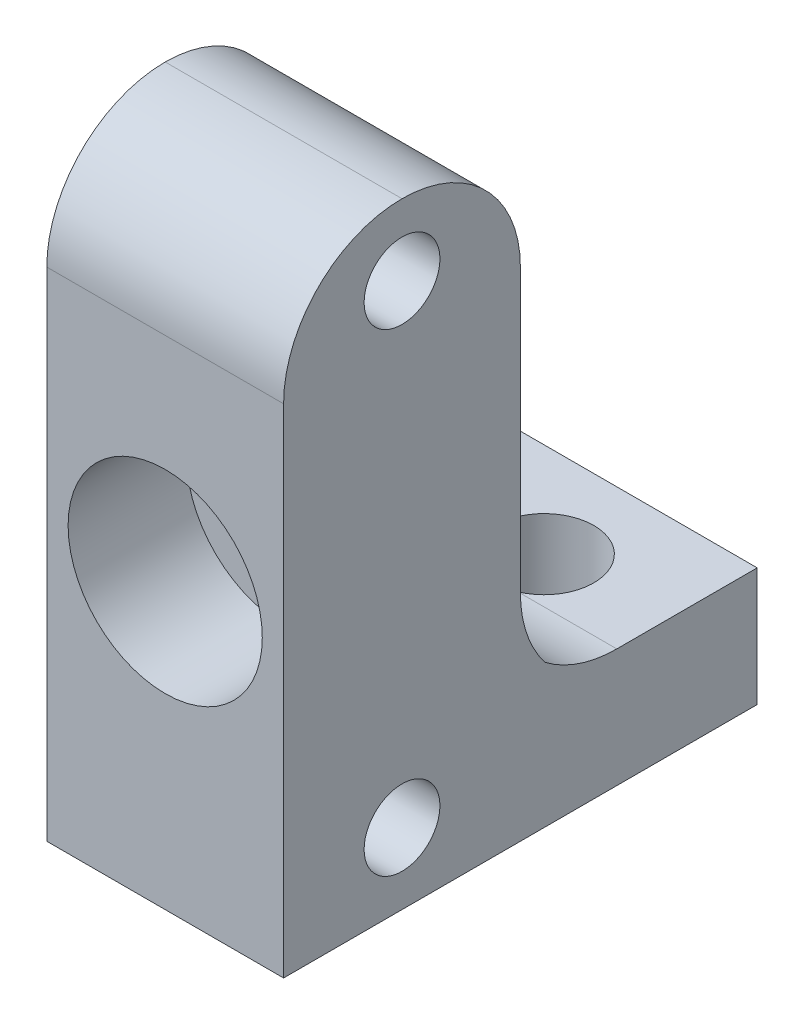
ISO-10303-21;
HEADER;
FILE_DESCRIPTION(('STEP AP214'),'2;1');
FILE_NAME('part.step','',(''),(''),'','','');
FILE_SCHEMA(('AUTOMOTIVE_DESIGN { 1 0 10303 214 1 1 1 1 }'));
ENDSEC;
DATA;
#1=APPLICATION_CONTEXT('core data for automotive mechanical design processes');
#2=APPLICATION_PROTOCOL_DEFINITION('international standard','automotive_design',2000,#1);
#3=PRODUCT_CONTEXT('',#1,'mechanical');
#4=PRODUCT('Part','Part','',(#3));
#5=PRODUCT_RELATED_PRODUCT_CATEGORY('part','',(#4));
#6=PRODUCT_DEFINITION_FORMATION('','',#4);
#7=PRODUCT_DEFINITION_CONTEXT('part definition',#1,'design');
#8=PRODUCT_DEFINITION('design','',#6,#7);
#9=PRODUCT_DEFINITION_SHAPE('','',#8);
#10=(LENGTH_UNIT() NAMED_UNIT(*) SI_UNIT(.MILLI.,.METRE.));
#11=(NAMED_UNIT(*) PLANE_ANGLE_UNIT() SI_UNIT($,.RADIAN.));
#12=(NAMED_UNIT(*) SI_UNIT($,.STERADIAN.) SOLID_ANGLE_UNIT());
#13=UNCERTAINTY_MEASURE_WITH_UNIT(LENGTH_MEASURE(1.E-05),#10,'distance_accuracy_value','');
#14=(GEOMETRIC_REPRESENTATION_CONTEXT(3) GLOBAL_UNCERTAINTY_ASSIGNED_CONTEXT((#13)) GLOBAL_UNIT_ASSIGNED_CONTEXT((#10,
#11,#12)) REPRESENTATION_CONTEXT('',''));
#15=CARTESIAN_POINT('',(0.,0.,0.));
#16=DIRECTION('',(0.,0.,1.));
#17=DIRECTION('',(1.,0.,0.));
#18=AXIS2_PLACEMENT_3D('',#15,#16,#17);
#19=CARTESIAN_POINT('',(5.,12.,10.));
#20=DIRECTION('',(0.,0.,-1.));
#21=DIRECTION('',(-1.,0.,0.));
#22=AXIS2_PLACEMENT_3D('',#19,#20,#21);
#23=CYLINDRICAL_SURFACE('',#22,4.1);
#24=CARTESIAN_POINT('',(5.,12.,10.));
#25=DIRECTION('',(0.,0.,1.));
#26=DIRECTION('',(1.,0.,0.));
#27=AXIS2_PLACEMENT_3D('',#24,#25,#26);
#28=CIRCLE('',#27,4.1);
#29=CARTESIAN_POINT('',(9.1,12.,10.));
#30=VERTEX_POINT('',#29);
#31=EDGE_CURVE('E191',#30,#30,#28,.T.);
#32=ORIENTED_EDGE('',*,*,#31,.T.);
#33=EDGE_LOOP('',(#32));
#34=FACE_BOUND('',#33,.T.);
#35=CARTESIAN_POINT('',(5.,12.,5.));
#36=DIRECTION('',(0.,0.,-1.));
#37=DIRECTION('',(-1.,0.,0.));
#38=AXIS2_PLACEMENT_3D('',#35,#36,#37);
#39=CIRCLE('',#38,4.1);
#40=CARTESIAN_POINT('',(0.899999999999999,12.,5.));
#41=VERTEX_POINT('',#40);
#42=EDGE_CURVE('E161',#41,#41,#39,.T.);
#43=ORIENTED_EDGE('',*,*,#42,.T.);
#44=EDGE_LOOP('',(#43));
#45=FACE_BOUND('',#44,.T.);
#46=ADVANCED_FACE('F40',(#34,#45),#23,.F.);
#47=CARTESIAN_POINT('',(0.,0.,0.));
#48=DIRECTION('',(0.,0.,-1.));
#49=DIRECTION('',(-1.,0.,0.));
#50=AXIS2_PLACEMENT_3D('',#47,#48,#49);
#51=PLANE('',#50);
#52=DIRECTION('',(0.,-1.,0.));
#53=VECTOR('',#52,1.);
#54=CARTESIAN_POINT('',(0.,0.,0.));
#55=LINE('',#54,#53);
#56=CARTESIAN_POINT('',(0.,21.,0.));
#57=VERTEX_POINT('',#56);
#58=CARTESIAN_POINT('',(0.,9.07106781186547,0.));
#59=VERTEX_POINT('',#58);
#60=EDGE_CURVE('E206',#57,#59,#55,.T.);
#61=ORIENTED_EDGE('',*,*,#60,.F.);
#62=DIRECTION('',(-1.,0.,0.));
#63=VECTOR('',#62,1.);
#64=CARTESIAN_POINT('',(10.,21.,0.));
#65=LINE('',#64,#63);
#66=CARTESIAN_POINT('',(10.,21.,0.));
#67=VERTEX_POINT('',#66);
#68=EDGE_CURVE('E249',#57,#67,#65,.F.);
#69=ORIENTED_EDGE('',*,*,#68,.T.);
#70=DIRECTION('',(0.,1.,0.));
#71=VECTOR('',#70,1.);
#72=CARTESIAN_POINT('',(10.,0.,0.));
#73=LINE('',#72,#71);
#74=CARTESIAN_POINT('',(10.,9.07106781186547,0.));
#75=VERTEX_POINT('',#74);
#76=EDGE_CURVE('E211',#75,#67,#73,.T.);
#77=ORIENTED_EDGE('',*,*,#76,.F.);
#78=DIRECTION('',(1.,0.,0.));
#79=VECTOR('',#78,1.);
#80=CARTESIAN_POINT('',(0.,9.07106781186547,0.));
#81=LINE('',#80,#79);
#82=EDGE_CURVE('E245',#75,#59,#81,.F.);
#83=ORIENTED_EDGE('',*,*,#82,.T.);
#84=EDGE_LOOP('',(#61,#69,#77,#83));
#85=FACE_BOUND('',#84,.T.);
#86=ADVANCED_FACE('F310',(#85),#51,.T.);
#87=CARTESIAN_POINT('',(0.,0.,10.));
#88=DIRECTION('',(0.,0.,-1.));
#89=DIRECTION('',(-1.,0.,0.));
#90=AXIS2_PLACEMENT_3D('',#87,#88,#89);
#91=PLANE('',#90);
#92=DIRECTION('',(0.,1.,0.));
#93=VECTOR('',#92,1.);
#94=CARTESIAN_POINT('',(10.,0.,10.));
#95=LINE('',#94,#93);
#96=CARTESIAN_POINT('',(10.,0.,10.));
#97=VERTEX_POINT('',#96);
#98=CARTESIAN_POINT('',(10.,21.,10.));
#99=VERTEX_POINT('',#98);
#100=EDGE_CURVE('E214',#97,#99,#95,.T.);
#101=ORIENTED_EDGE('',*,*,#100,.T.);
#102=DIRECTION('',(-1.,0.,0.));
#103=VECTOR('',#102,1.);
#104=CARTESIAN_POINT('',(0.,21.,10.));
#105=LINE('',#104,#103);
#106=CARTESIAN_POINT('',(0.,21.,10.));
#107=VERTEX_POINT('',#106);
#108=EDGE_CURVE('E228',#99,#107,#105,.T.);
#109=ORIENTED_EDGE('',*,*,#108,.T.);
#110=DIRECTION('',(0.,-1.,0.));
#111=VECTOR('',#110,1.);
#112=CARTESIAN_POINT('',(0.,0.,10.));
#113=LINE('',#112,#111);
#114=CARTESIAN_POINT('',(0.,0.,10.));
#115=VERTEX_POINT('',#114);
#116=EDGE_CURVE('E207',#107,#115,#113,.T.);
#117=ORIENTED_EDGE('',*,*,#116,.T.);
#118=DIRECTION('',(1.,0.,0.));
#119=VECTOR('',#118,1.);
#120=CARTESIAN_POINT('',(0.,0.,10.));
#121=LINE('',#120,#119);
#122=EDGE_CURVE('E210',#115,#97,#121,.T.);
#123=ORIENTED_EDGE('',*,*,#122,.T.);
#124=EDGE_LOOP('',(#101,#109,#117,#123));
#125=FACE_BOUND('',#124,.T.);
#126=ORIENTED_EDGE('',*,*,#31,.F.);
#127=EDGE_LOOP('',(#126));
#128=FACE_BOUND('',#127,.T.);
#129=ADVANCED_FACE('F318',(#125,#128),#91,.F.);
#130=CARTESIAN_POINT('',(0.,0.,10.));
#131=DIRECTION('',(1.,0.,0.));
#132=DIRECTION('',(0.,0.,-1.));
#133=AXIS2_PLACEMENT_3D('',#130,#131,#132);
#134=PLANE('',#133);
#135=CARTESIAN_POINT('',(0.,23.,5.));
#136=DIRECTION('',(-1.,0.,0.));
#137=DIRECTION('',(0.,0.,1.));
#138=AXIS2_PLACEMENT_3D('',#135,#136,#137);
#139=CIRCLE('',#138,1.6);
#140=CARTESIAN_POINT('',(0.,23.,6.6));
#141=VERTEX_POINT('',#140);
#142=EDGE_CURVE('E192',#141,#141,#139,.T.);
#143=ORIENTED_EDGE('',*,*,#142,.F.);
#144=EDGE_LOOP('',(#143));
#145=FACE_BOUND('',#144,.T.);
#146=CARTESIAN_POINT('',(0.,3.,5.));
#147=DIRECTION('',(-1.,0.,0.));
#148=DIRECTION('',(0.,0.,1.));
#149=AXIS2_PLACEMENT_3D('',#146,#147,#148);
#150=CIRCLE('',#149,1.6);
#151=CARTESIAN_POINT('',(0.,3.,6.6));
#152=VERTEX_POINT('',#151);
#153=EDGE_CURVE('E184',#152,#152,#150,.T.);
#154=ORIENTED_EDGE('',*,*,#153,.F.);
#155=EDGE_LOOP('',(#154));
#156=FACE_BOUND('',#155,.T.);
#157=ORIENTED_EDGE('',*,*,#116,.F.);
#158=CARTESIAN_POINT('',(0.,21.,5.));
#159=DIRECTION('',(1.,0.,0.));
#160=DIRECTION('',(0.,0.,-1.));
#161=AXIS2_PLACEMENT_3D('',#158,#159,#160);
#162=CIRCLE('',#161,5.);
#163=CARTESIAN_POINT('',(0.,26.,5.));
#164=VERTEX_POINT('',#163);
#165=EDGE_CURVE('E236',#107,#164,#162,.F.);
#166=ORIENTED_EDGE('',*,*,#165,.T.);
#167=CARTESIAN_POINT('',(0.,21.,5.));
#168=DIRECTION('',(1.,0.,0.));
#169=DIRECTION('',(0.,0.,-1.));
#170=AXIS2_PLACEMENT_3D('',#167,#168,#169);
#171=CIRCLE('',#170,5.);
#172=EDGE_CURVE('E233',#164,#57,#171,.F.);
#173=ORIENTED_EDGE('',*,*,#172,.T.);
#174=ORIENTED_EDGE('',*,*,#60,.T.);
#175=CARTESIAN_POINT('',(0.,9.07106781186547,-5.));
#176=DIRECTION('',(1.,0.,0.));
#177=DIRECTION('',(0.,0.,-1.));
#178=AXIS2_PLACEMENT_3D('',#175,#176,#177);
#179=CIRCLE('',#178,5.);
#180=CARTESIAN_POINT('',(0.,6.03064143290852,-1.03064143290849));
#181=VERTEX_POINT('',#180);
#182=EDGE_CURVE('E145',#59,#181,#179,.T.);
#183=ORIENTED_EDGE('',*,*,#182,.T.);
#184=CARTESIAN_POINT('',(0.,10.,-4.07106781186548));
#185=DIRECTION('',(1.,0.,0.));
#186=DIRECTION('',(0.,0.,-1.));
#187=AXIS2_PLACEMENT_3D('',#184,#185,#186);
#188=CIRCLE('',#187,5.);
#189=CARTESIAN_POINT('',(0.,5.,-4.07106781186548));
#190=VERTEX_POINT('',#189);
#191=EDGE_CURVE('E11',#181,#190,#188,.T.);
#192=ORIENTED_EDGE('',*,*,#191,.T.);
#193=DIRECTION('',(0.,0.,-1.));
#194=VECTOR('',#193,1.);
#195=CARTESIAN_POINT('',(0.,5.,0.));
#196=LINE('',#195,#194);
#197=CARTESIAN_POINT('',(0.,5.,-10.));
#198=VERTEX_POINT('',#197);
#199=EDGE_CURVE('E141',#190,#198,#196,.T.);
#200=ORIENTED_EDGE('',*,*,#199,.T.);
#201=DIRECTION('',(0.,-1.,0.));
#202=VECTOR('',#201,1.);
#203=CARTESIAN_POINT('',(0.,5.,-10.));
#204=LINE('',#203,#202);
#205=CARTESIAN_POINT('',(0.,0.,-10.));
#206=VERTEX_POINT('',#205);
#207=EDGE_CURVE('E177',#198,#206,#204,.T.);
#208=ORIENTED_EDGE('',*,*,#207,.T.);
#209=DIRECTION('',(0.,0.,-1.));
#210=VECTOR('',#209,1.);
#211=CARTESIAN_POINT('',(0.,0.,10.));
#212=LINE('',#211,#210);
#213=EDGE_CURVE('E85',#115,#206,#212,.T.);
#214=ORIENTED_EDGE('',*,*,#213,.F.);
#215=EDGE_LOOP('',(#157,#166,#173,#174,#183,#192,#200,#208,#214));
#216=FACE_BOUND('',#215,.T.);
#217=ADVANCED_FACE('F327',(#145,#156,#216),#134,.F.);
#218=CARTESIAN_POINT('',(0.,0.,10.));
#219=DIRECTION('',(0.,1.,0.));
#220=DIRECTION('',(0.,0.,1.));
#221=AXIS2_PLACEMENT_3D('',#218,#219,#220);
#222=PLANE('',#221);
#223=CARTESIAN_POINT('',(5.,0.,-5.99999999999999));
#224=DIRECTION('',(0.,1.,0.));
#225=DIRECTION('',(0.,0.,1.));
#226=AXIS2_PLACEMENT_3D('',#223,#224,#225);
#227=CIRCLE('',#226,2.1);
#228=CARTESIAN_POINT('',(5.,0.,-3.89999999999999));
#229=VERTEX_POINT('',#228);
#230=EDGE_CURVE('E152',#229,#229,#227,.T.);
#231=ORIENTED_EDGE('',*,*,#230,.T.);
#232=EDGE_LOOP('',(#231));
#233=FACE_BOUND('',#232,.T.);
#234=ORIENTED_EDGE('',*,*,#213,.T.);
#235=DIRECTION('',(1.,0.,0.));
#236=VECTOR('',#235,1.);
#237=CARTESIAN_POINT('',(10.,0.,-10.));
#238=LINE('',#237,#236);
#239=CARTESIAN_POINT('',(10.,0.,-10.));
#240=VERTEX_POINT('',#239);
#241=EDGE_CURVE('E170',#206,#240,#238,.T.);
#242=ORIENTED_EDGE('',*,*,#241,.T.);
#243=DIRECTION('',(0.,0.,-1.));
#244=VECTOR('',#243,1.);
#245=CARTESIAN_POINT('',(10.,0.,10.));
#246=LINE('',#245,#244);
#247=EDGE_CURVE('E218',#97,#240,#246,.T.);
#248=ORIENTED_EDGE('',*,*,#247,.F.);
#249=ORIENTED_EDGE('',*,*,#122,.F.);
#250=EDGE_LOOP('',(#234,#242,#248,#249));
#251=FACE_BOUND('',#250,.T.);
#252=ADVANCED_FACE('F333',(#233,#251),#222,.F.);
#253=CARTESIAN_POINT('',(10.,0.,10.));
#254=DIRECTION('',(-1.,0.,0.));
#255=DIRECTION('',(0.,-1.,0.));
#256=AXIS2_PLACEMENT_3D('',#253,#254,#255);
#257=PLANE('',#256);
#258=CARTESIAN_POINT('',(10.,23.,5.));
#259=DIRECTION('',(-1.,0.,0.));
#260=DIRECTION('',(0.,0.,1.));
#261=AXIS2_PLACEMENT_3D('',#258,#259,#260);
#262=CIRCLE('',#261,1.6);
#263=CARTESIAN_POINT('',(10.,23.,6.6));
#264=VERTEX_POINT('',#263);
#265=EDGE_CURVE('E187',#264,#264,#262,.T.);
#266=ORIENTED_EDGE('',*,*,#265,.T.);
#267=EDGE_LOOP('',(#266));
#268=FACE_BOUND('',#267,.T.);
#269=CARTESIAN_POINT('',(10.,3.,5.));
#270=DIRECTION('',(-1.,0.,0.));
#271=DIRECTION('',(0.,0.,1.));
#272=AXIS2_PLACEMENT_3D('',#269,#270,#271);
#273=CIRCLE('',#272,1.6);
#274=CARTESIAN_POINT('',(10.,3.,6.6));
#275=VERTEX_POINT('',#274);
#276=EDGE_CURVE('E196',#275,#275,#273,.T.);
#277=ORIENTED_EDGE('',*,*,#276,.T.);
#278=EDGE_LOOP('',(#277));
#279=FACE_BOUND('',#278,.T.);
#280=CARTESIAN_POINT('',(10.,21.,5.));
#281=DIRECTION('',(-1.,0.,0.));
#282=DIRECTION('',(0.,-1.,0.));
#283=AXIS2_PLACEMENT_3D('',#280,#281,#282);
#284=CIRCLE('',#283,5.);
#285=CARTESIAN_POINT('',(10.,26.,5.));
#286=VERTEX_POINT('',#285);
#287=EDGE_CURVE('E239',#67,#286,#284,.F.);
#288=ORIENTED_EDGE('',*,*,#287,.T.);
#289=CARTESIAN_POINT('',(10.,21.,5.));
#290=DIRECTION('',(-1.,0.,0.));
#291=DIRECTION('',(0.,-1.,0.));
#292=AXIS2_PLACEMENT_3D('',#289,#290,#291);
#293=CIRCLE('',#292,5.);
#294=EDGE_CURVE('E242',#286,#99,#293,.F.);
#295=ORIENTED_EDGE('',*,*,#294,.T.);
#296=ORIENTED_EDGE('',*,*,#100,.F.);
#297=ORIENTED_EDGE('',*,*,#247,.T.);
#298=DIRECTION('',(0.,-1.,0.));
#299=VECTOR('',#298,1.);
#300=CARTESIAN_POINT('',(10.,5.,-10.));
#301=LINE('',#300,#299);
#302=CARTESIAN_POINT('',(10.,5.,-10.));
#303=VERTEX_POINT('',#302);
#304=EDGE_CURVE('E180',#303,#240,#301,.T.);
#305=ORIENTED_EDGE('',*,*,#304,.F.);
#306=DIRECTION('',(0.,0.,1.));
#307=VECTOR('',#306,1.);
#308=CARTESIAN_POINT('',(10.,5.,0.));
#309=LINE('',#308,#307);
#310=CARTESIAN_POINT('',(10.,5.,-4.07106781186548));
#311=VERTEX_POINT('',#310);
#312=EDGE_CURVE('E167',#303,#311,#309,.T.);
#313=ORIENTED_EDGE('',*,*,#312,.T.);
#314=CARTESIAN_POINT('',(10.,10.,-4.07106781186548));
#315=DIRECTION('',(-1.,0.,0.));
#316=DIRECTION('',(0.,-1.,0.));
#317=AXIS2_PLACEMENT_3D('',#314,#315,#316);
#318=CIRCLE('',#317,5.);
#319=CARTESIAN_POINT('',(10.,6.03064143290852,-1.03064143290849));
#320=VERTEX_POINT('',#319);
#321=EDGE_CURVE('E51',#311,#320,#318,.T.);
#322=ORIENTED_EDGE('',*,*,#321,.T.);
#323=CARTESIAN_POINT('',(10.,9.07106781186547,-5.));
#324=DIRECTION('',(-1.,0.,0.));
#325=DIRECTION('',(0.,-1.,0.));
#326=AXIS2_PLACEMENT_3D('',#323,#324,#325);
#327=CIRCLE('',#326,5.);
#328=EDGE_CURVE('E256',#320,#75,#327,.T.);
#329=ORIENTED_EDGE('',*,*,#328,.T.);
#330=ORIENTED_EDGE('',*,*,#76,.T.);
#331=EDGE_LOOP('',(#288,#295,#296,#297,#305,#313,#322,#329,#330));
#332=FACE_BOUND('',#331,.T.);
#333=ADVANCED_FACE('F330',(#268,#279,#332),#257,.F.);
#334=CARTESIAN_POINT('',(10.,3.,5.));
#335=DIRECTION('',(-1.,0.,0.));
#336=DIRECTION('',(0.,0.,1.));
#337=AXIS2_PLACEMENT_3D('',#334,#335,#336);
#338=CYLINDRICAL_SURFACE('',#337,1.6);
#339=ORIENTED_EDGE('',*,*,#276,.F.);
#340=EDGE_LOOP('',(#339));
#341=FACE_BOUND('',#340,.T.);
#342=ORIENTED_EDGE('',*,*,#153,.T.);
#343=EDGE_LOOP('',(#342));
#344=FACE_BOUND('',#343,.T.);
#345=ADVANCED_FACE('F324',(#341,#344),#338,.F.);
#346=CARTESIAN_POINT('',(10.,23.,5.));
#347=DIRECTION('',(-1.,0.,0.));
#348=DIRECTION('',(0.,0.,1.));
#349=AXIS2_PLACEMENT_3D('',#346,#347,#348);
#350=CYLINDRICAL_SURFACE('',#349,1.6);
#351=ORIENTED_EDGE('',*,*,#265,.F.);
#352=EDGE_LOOP('',(#351));
#353=FACE_BOUND('',#352,.T.);
#354=ORIENTED_EDGE('',*,*,#142,.T.);
#355=EDGE_LOOP('',(#354));
#356=FACE_BOUND('',#355,.T.);
#357=ADVANCED_FACE('F369',(#353,#356),#350,.F.);
#358=CARTESIAN_POINT('',(10.,5.,-10.));
#359=DIRECTION('',(0.,0.,-1.));
#360=DIRECTION('',(-1.,0.,0.));
#361=AXIS2_PLACEMENT_3D('',#358,#359,#360);
#362=PLANE('',#361);
#363=ORIENTED_EDGE('',*,*,#241,.F.);
#364=ORIENTED_EDGE('',*,*,#207,.F.);
#365=DIRECTION('',(1.,0.,0.));
#366=VECTOR('',#365,1.);
#367=CARTESIAN_POINT('',(10.,5.,-10.));
#368=LINE('',#367,#366);
#369=EDGE_CURVE('E173',#198,#303,#368,.T.);
#370=ORIENTED_EDGE('',*,*,#369,.T.);
#371=ORIENTED_EDGE('',*,*,#304,.T.);
#372=EDGE_LOOP('',(#363,#364,#370,#371));
#373=FACE_BOUND('',#372,.T.);
#374=ADVANCED_FACE('F366',(#373),#362,.T.);
#375=CARTESIAN_POINT('',(0.,5.,0.));
#376=DIRECTION('',(0.,1.,0.));
#377=DIRECTION('',(0.,0.,1.));
#378=AXIS2_PLACEMENT_3D('',#375,#376,#377);
#379=PLANE('',#378);
#380=ORIENTED_EDGE('',*,*,#199,.F.);
#381=DIRECTION('',(-1.,0.,0.));
#382=VECTOR('',#381,1.);
#383=CARTESIAN_POINT('',(0.,5.,-4.07106781186548));
#384=LINE('',#383,#382);
#385=CARTESIAN_POINT('',(4.16980688175666,5.,-4.07106781186548));
#386=VERTEX_POINT('',#385);
#387=EDGE_CURVE('E135',#190,#386,#384,.F.);
#388=ORIENTED_EDGE('',*,*,#387,.T.);
#389=CARTESIAN_POINT('',(5.,5.,-5.99999999999999));
#390=DIRECTION('',(0.,1.,0.));
#391=DIRECTION('',(0.,0.,1.));
#392=AXIS2_PLACEMENT_3D('',#389,#390,#391);
#393=CIRCLE('',#392,2.1);
#394=CARTESIAN_POINT('',(5.83019311824334,5.,-4.07106781186548));
#395=VERTEX_POINT('',#394);
#396=EDGE_CURVE('E138',#395,#386,#393,.T.);
#397=ORIENTED_EDGE('',*,*,#396,.F.);
#398=DIRECTION('',(-1.,0.,0.));
#399=VECTOR('',#398,1.);
#400=CARTESIAN_POINT('',(0.,5.,-4.07106781186548));
#401=LINE('',#400,#399);
#402=EDGE_CURVE('E146',#395,#311,#401,.F.);
#403=ORIENTED_EDGE('',*,*,#402,.T.);
#404=ORIENTED_EDGE('',*,*,#312,.F.);
#405=ORIENTED_EDGE('',*,*,#369,.F.);
#406=EDGE_LOOP('',(#380,#388,#397,#403,#404,#405));
#407=FACE_BOUND('',#406,.T.);
#408=ADVANCED_FACE('F137',(#407),#379,.T.);
#409=CARTESIAN_POINT('',(5.,0.,-5.99999999999999));
#410=DIRECTION('',(0.,1.,0.));
#411=DIRECTION('',(0.,0.,1.));
#412=AXIS2_PLACEMENT_3D('',#409,#410,#411);
#413=CYLINDRICAL_SURFACE('',#412,2.1);
#414=ORIENTED_EDGE('',*,*,#230,.F.);
#415=EDGE_LOOP('',(#414));
#416=FACE_BOUND('',#415,.T.);
#417=ORIENTED_EDGE('',*,*,#396,.T.);
#418=EDGE_CURVE('E150',#386,#395,#393,.T.);
#419=ORIENTED_EDGE('',*,*,#418,.T.);
#420=EDGE_LOOP('',(#417,#419));
#421=FACE_BOUND('',#420,.T.);
#422=ADVANCED_FACE('F149',(#416,#421),#413,.F.);
#423=CARTESIAN_POINT('',(5.,12.,5.));
#424=DIRECTION('',(0.,0.,-1.));
#425=DIRECTION('',(-1.,0.,0.));
#426=AXIS2_PLACEMENT_3D('',#423,#424,#425);
#427=PLANE('',#426);
#428=ORIENTED_EDGE('',*,*,#42,.F.);
#429=EDGE_LOOP('',(#428));
#430=FACE_BOUND('',#429,.T.);
#431=ADVANCED_FACE('F382',(#430),#427,.F.);
#432=CARTESIAN_POINT('',(0.,21.,5.));
#433=DIRECTION('',(1.,0.,0.));
#434=DIRECTION('',(0.,0.,-1.));
#435=AXIS2_PLACEMENT_3D('',#432,#433,#434);
#436=CYLINDRICAL_SURFACE('',#435,5.);
#437=DIRECTION('',(-1.,0.,0.));
#438=VECTOR('',#437,1.);
#439=CARTESIAN_POINT('',(0.,26.,5.));
#440=LINE('',#439,#438);
#441=EDGE_CURVE('E158',#286,#164,#440,.T.);
#442=ORIENTED_EDGE('',*,*,#441,.F.);
#443=ORIENTED_EDGE('',*,*,#287,.F.);
#444=ORIENTED_EDGE('',*,*,#68,.F.);
#445=ORIENTED_EDGE('',*,*,#172,.F.);
#446=EDGE_LOOP('',(#442,#443,#444,#445));
#447=FACE_BOUND('',#446,.T.);
#448=ADVANCED_FACE('F358',(#447),#436,.T.);
#449=CARTESIAN_POINT('',(0.,21.,5.));
#450=DIRECTION('',(-1.,0.,0.));
#451=DIRECTION('',(0.,0.,1.));
#452=AXIS2_PLACEMENT_3D('',#449,#450,#451);
#453=CYLINDRICAL_SURFACE('',#452,5.);
#454=ORIENTED_EDGE('',*,*,#294,.F.);
#455=ORIENTED_EDGE('',*,*,#441,.T.);
#456=ORIENTED_EDGE('',*,*,#165,.F.);
#457=ORIENTED_EDGE('',*,*,#108,.F.);
#458=EDGE_LOOP('',(#454,#455,#456,#457));
#459=FACE_BOUND('',#458,.T.);
#460=ADVANCED_FACE('F354',(#459),#453,.T.);
#461=CARTESIAN_POINT('',(0.,10.,-4.07106781186548));
#462=DIRECTION('',(-1.,0.,0.));
#463=DIRECTION('',(0.,0.,1.));
#464=AXIS2_PLACEMENT_3D('',#461,#462,#463);
#465=CYLINDRICAL_SURFACE('',#464,5.);
#466=CARTESIAN_POINT('',(4.16980688175666,10.,-4.07106781186548));
#467=DIRECTION('',(-1.,0.,0.));
#468=DIRECTION('',(0.,0.,1.));
#469=AXIS2_PLACEMENT_3D('',#466,#467,#468);
#470=CIRCLE('',#469,5.);
#471=CARTESIAN_POINT('',(4.16980688175666,6.03064143290853,-1.0306414329085));
#472=VERTEX_POINT('',#471);
#473=EDGE_CURVE('E44',#386,#472,#470,.T.);
#474=ORIENTED_EDGE('',*,*,#473,.F.);
#475=ORIENTED_EDGE('',*,*,#387,.F.);
#476=ORIENTED_EDGE('',*,*,#191,.F.);
#477=DIRECTION('',(-1.,0.,0.));
#478=VECTOR('',#477,1.);
#479=CARTESIAN_POINT('',(2.08490344087833,6.03064143290852,-1.03064143290849));
#480=LINE('',#479,#478);
#481=EDGE_CURVE('E155',#472,#181,#480,.T.);
#482=ORIENTED_EDGE('',*,*,#481,.F.);
#483=EDGE_LOOP('',(#474,#475,#476,#482));
#484=FACE_BOUND('',#483,.T.);
#485=ADVANCED_FACE('F42',(#484),#465,.F.);
#486=CARTESIAN_POINT('',(3.29074398401378,5.,-4.77998201988048));
#487=CARTESIAN_POINT('',(2.97285397178433,4.64720581337549,-2.35279418662449));
#488=CARTESIAN_POINT('',(2.44901876033558,6.35635110373903,-0.643648896260978));
#489=CARTESIAN_POINT('',(3.31018876398218,5.,-4.75277389317255));
#490=CARTESIAN_POINT('',(3.01036513089454,4.66383985255783,-2.33616014744216));
#491=CARTESIAN_POINT('',(2.51974686079217,6.36719383930864,-0.632806160691366));
#492=CARTESIAN_POINT('',(3.33097566484691,5.,-4.72499460040769));
#493=CARTESIAN_POINT('',(3.04907509889409,4.68036074942234,-2.31963925057765));
#494=CARTESIAN_POINT('',(2.59075762963924,6.37709769653345,-0.622902303466557));
#495=CARTESIAN_POINT('',(3.3757864940848,5.,-4.66836301668054));
#496=CARTESIAN_POINT('',(3.12909535489073,4.71309589090597,-2.28690410909402));
#497=CARTESIAN_POINT('',(2.73321927385082,6.3951057684878,-0.604894231512206));
#498=CARTESIAN_POINT('',(3.39980973218056,5.,-4.63951095547622));
#499=CARTESIAN_POINT('',(3.17039523610424,4.72930955052378,-2.27069044947621));
#500=CARTESIAN_POINT('',(2.80467005227305,6.40321036600749,-0.596789633992515));
#501=CARTESIAN_POINT('',(3.45157071046262,5.,-4.58088566753729));
#502=CARTESIAN_POINT('',(3.25574437373413,4.7613451645771,-2.23865483542289));
#503=CARTESIAN_POINT('',(2.94768704515626,6.41767934811636,-0.582320651883647));
#504=CARTESIAN_POINT('',(3.47929629324535,5.,-4.55111569112485));
#505=CARTESIAN_POINT('',(3.29977346042319,4.77716769234962,-2.22283230765037));
#506=CARTESIAN_POINT('',(3.01925215486185,6.42404922930613,-0.575950770693875));
#507=CARTESIAN_POINT('',(3.5391890380715,5.,-4.49074802387307));
#508=CARTESIAN_POINT('',(3.39103254092952,4.8084006846895,-2.19159931531049));
#509=CARTESIAN_POINT('',(3.16263158301047,6.43519657604542,-0.564803423954592));
#510=CARTESIAN_POINT('',(3.57135641099523,5.,-4.46015029379044));
#511=CARTESIAN_POINT('',(3.43825163064018,4.82381125153716,-2.17618874846283));
#512=CARTESIAN_POINT('',(3.2344459131277,6.43997396595235,-0.560026034047661));
#513=CARTESIAN_POINT('',(3.64080478346516,5.,-4.39851960531856));
#514=CARTESIAN_POINT('',(3.53615458321506,4.85406952504144,-2.14593047495855));
#515=CARTESIAN_POINT('',(3.3780969227931,6.44807248435647,-0.551927515643538));
#516=CARTESIAN_POINT('',(3.6780758002015,5.,-4.3674876002269));
#517=CARTESIAN_POINT('',(3.58682049068482,4.86891910061099,-2.131080899389));
#518=CARTESIAN_POINT('',(3.44993329206642,6.45139640391077,-0.548603596089234));
#519=CARTESIAN_POINT('',(3.75855698022624,5.,-4.30547941261513));
#520=CARTESIAN_POINT('',(3.69206452388396,4.8978991469894,-2.10210085301059));
#521=CARTESIAN_POINT('',(3.59370115323536,6.45678286329033,-0.543217136709685));
#522=CARTESIAN_POINT('',(3.80176738856273,5.,-4.27450323245169));
#523=CARTESIAN_POINT('',(3.74663337493194,4.91203169547722,-2.08796830452278));
#524=CARTESIAN_POINT('',(3.66563264893438,6.45884535105213,-0.541154648947879));
#525=CARTESIAN_POINT('',(3.89489780164269,5.,-4.21342490715211));
#526=CARTESIAN_POINT('',(3.86005016620593,4.93931152665995,-2.06068847334004));
#527=CARTESIAN_POINT('',(3.80959846213228,6.46193190263739,-0.538068097362613));
#528=CARTESIAN_POINT('',(3.94482342645699,5.,-4.18332352008544));
#529=CARTESIAN_POINT('',(3.91889579277146,4.9524617217261,-2.04753827827389));
#530=CARTESIAN_POINT('',(3.88163281520689,6.46295509045332,-0.537044909546691));
#531=CARTESIAN_POINT('',(4.05188121377338,5.,-4.12522585699052));
#532=CARTESIAN_POINT('',(4.0410109819041,4.97737899371169,-2.02262100628831));
#533=CARTESIAN_POINT('',(4.02571397905591,6.46422207753351,-0.535777922466498));
#534=CARTESIAN_POINT('',(4.10901345159998,5.,-4.09722960297029));
#535=CARTESIAN_POINT('',(4.10428114095985,4.98915169437674,-2.01084830562325));
#536=CARTESIAN_POINT('',(4.09776078995266,6.46446586865072,-0.53553413134929));
#537=CARTESIAN_POINT('',(4.24358497277682,5.,-4.03931821325106));
#538=CARTESIAN_POINT('',(4.24913746236411,5.0131338190567,-1.9868661809433));
#539=CARTESIAN_POINT('',(4.2572408649322,6.46446636762928,-0.53553363237073));
#540=CARTESIAN_POINT('',(4.32275525063088,5.,-4.01027037159124));
#541=CARTESIAN_POINT('',(4.33180788128335,5.02491823662992,-1.97508176337007));
#542=CARTESIAN_POINT('',(4.34467378903794,6.46410792101587,-0.535892078984141));
#543=CARTESIAN_POINT('',(4.49060762153698,5.,-3.96084736069501));
#544=CARTESIAN_POINT('',(4.50265252465297,5.04472376257063,-1.95527623742936));
#545=CARTESIAN_POINT('',(4.51953644727886,6.46320467826519,-0.536795321734819));
#546=CARTESIAN_POINT('',(4.57928967550546,5.,-3.94047215582474));
#547=CARTESIAN_POINT('',(4.590876921351,5.05275963574838,-1.94724036425161));
#548=CARTESIAN_POINT('',(4.60696618142568,6.4626598828936,-0.537340117106406));
#549=CARTESIAN_POINT('',(4.76272276662491,5.,-3.91138941909167));
#550=CARTESIAN_POINT('',(4.77071848566552,5.06416485361242,-1.93583514638758));
#551=CARTESIAN_POINT('',(4.78179663958065,6.46181881743427,-0.538181182565744));
#552=CARTESIAN_POINT('',(4.85747156077459,5.,-3.90267760083255));
#553=CARTESIAN_POINT('',(4.86241615292866,5.06754689925924,-1.93245310074076));
#554=CARTESIAN_POINT('',(4.86919736243823,6.46152245605983,-0.53847754394018));
#555=CARTESIAN_POINT('',(5.04790382428472,5.,-3.8983884651538));
#556=CARTESIAN_POINT('',(5.04624693693497,5.06921413304792,-1.93078586695207));
#557=CARTESIAN_POINT('',(5.04400001816008,6.46138099497297,-0.538619005027039));
#558=CARTESIAN_POINT('',(5.14358729707841,5.,-3.90281119599751));
#559=CARTESIAN_POINT('',(5.13847857386692,5.06750108966895,-1.93249891033104));
#560=CARTESIAN_POINT('',(5.13140195102761,6.46153589691872,-0.538464103081281));
#561=CARTESIAN_POINT('',(5.33059463256235,5.,-3.92404231654091));
#562=CARTESIAN_POINT('',(5.32042343850254,5.05921141304933,-1.94078858695066));
#563=CARTESIAN_POINT('',(5.30636422270853,6.46219308999101,-0.537806910009001));
#564=CARTESIAN_POINT('',(5.42191010434874,5.,-3.94087359971402));
#565=CARTESIAN_POINT('',(5.41022171403255,5.0526173434951,-1.94738265650489));
#566=CARTESIAN_POINT('',(5.3939245555046,6.46269602312113,-0.537303976878875));
#567=CARTESIAN_POINT('',(5.59588530282807,5.,-3.98431444051504));
#568=CARTESIAN_POINT('',(5.58473277351479,5.03535589704722,-1.96464410295278));
#569=CARTESIAN_POINT('',(5.56904289474118,6.46367635753672,-0.536323642463294));
#570=CARTESIAN_POINT('',(5.67854527330098,5.,-4.01092372265288));
#571=CARTESIAN_POINT('',(5.66950723037725,5.02467437175463,-1.97532562824537));
#572=CARTESIAN_POINT('',(5.65660090117773,6.46415375954106,-0.535846240458945));
#573=CARTESIAN_POINT('',(5.83328881162156,5.,-4.07061258229477));
#574=CARTESIAN_POINT('',(5.83277524877732,5.0002454125409,-1.9997545874591));
#575=CARTESIAN_POINT('',(5.83177060108331,6.46456599791519,-0.535434002084823));
#576=CARTESIAN_POINT('',(5.9053665363109,5.,-4.10369571109561));
#577=CARTESIAN_POINT('',(5.91129402380436,4.98648208603685,-2.01351791396315));
#578=CARTESIAN_POINT('',(5.91938229758939,6.4645005356718,-0.535499464328205));
#579=CARTESIAN_POINT('',(6.0054120641436,5.,-4.15593832702226));
#580=CARTESIAN_POINT('',(6.02405934867751,4.96424433881988,-2.03575566118012));
#581=CARTESIAN_POINT('',(6.05079673182698,6.46359474778942,-0.53640525221059));
#582=CARTESIAN_POINT('',(6.03741760587251,5.,-4.1737903661635));
#583=CARTESIAN_POINT('',(6.06085666275836,4.95655556455926,-2.04344443544073));
#584=CARTESIAN_POINT('',(6.09460448465474,6.46315815302441,-0.536841846975601));
#585=CARTESIAN_POINT('',(6.09884690213526,5.,-4.21008270694336));
#586=CARTESIAN_POINT('',(6.13284868187529,4.94072957561677,-2.05927042438322));
#587=CARTESIAN_POINT('',(6.18221296333729,6.46195528417916,-0.538044715820851));
#588=CARTESIAN_POINT('',(6.12827052828142,5.,-4.22852303777312));
#589=CARTESIAN_POINT('',(6.16804276044062,4.93259124096007,-2.06740875903992));
#590=CARTESIAN_POINT('',(6.22601368873467,6.46118899371573,-0.538811006284281));
#591=CARTESIAN_POINT('',(6.15645720065145,5.,-4.24711473762216));
#592=CARTESIAN_POINT('',(6.20242547156643,4.92428087242856,-2.07571912757143));
#593=CARTESIAN_POINT('',(6.26980688175666,6.46022766661114,-0.539772333388866));
#594=(BOUNDED_SURFACE() B_SPLINE_SURFACE(3,2,((#486,#487,#488),(#489,#490,#491),(#492,#493,
#494),(#495,#496,#497),(#498,#499,#500),(#501,#502,#503),(#504,#505,#506),(#507,#508,#509),
(#510,#511,#512),(#513,#514,#515),(#516,#517,#518),(#519,#520,#521),(#522,#523,#524),(#525,#526,
#527),(#528,#529,#530),(#531,#532,#533),(#534,#535,#536),(#537,#538,#539),(#540,#541,#542),
(#543,#544,#545),(#546,#547,#548),(#549,#550,#551),(#552,#553,#554),(#555,#556,#557),(#558,#559,
#560),(#561,#562,#563),(#564,#565,#566),(#567,#568,#569),(#570,#571,#572),(#573,#574,#575),
(#576,#577,#578),(#579,#580,#581),(#582,#583,#584),(#585,#586,#587),(#588,#589,#590),(#591,#592,
#593)),.UNSPECIFIED.,.F.,.F.,.F.) B_SPLINE_SURFACE_WITH_KNOTS((4,2,2,2,2,2,2,2,2,2,2,2,2,2,2,2,
2,4),(3,3),(0.,0.217093607200831,0.434140983665669,0.650492405894039,0.866854103248263,
1.08279848317133,1.29875177522799,1.51488693982542,1.73102436368408,1.99332527977923,
2.25562511813034,2.51782853251657,2.78003291037903,3.0427222633463,3.30540421574397,
3.56823067109645,3.69966466185852,3.83110518457433),(0.,1.),
.UNSPECIFIED.) GEOMETRIC_REPRESENTATION_ITEM() RATIONAL_B_SPLINE_SURFACE(((1.,0.896340106330505,
1.),(1.,0.8974133111126,1.),(1.,0.898507108722411,1.),(1.,0.90073274496739,1.),(1.,
0.901864575452006,1.),(1.,0.904159906523391,1.),(1.,0.905323293924368,1.),(1.,0.907677752809596,
1.),(1.,0.908868825606017,1.),(1.,0.911263123831037,1.),(1.,0.912466321388607,1.),(1.,
0.914865796041139,1.),(1.,0.916062072848442,1.),(1.,0.918416358694968,1.),(1.,0.919574334657177,
1.),(1.,0.921805339303975,1.),(1.,0.922878367100484,1.),(1.,0.925094533418999,1.),(1.,
0.92620369695992,1.),(1.,0.928088390204662,1.),(1.,0.928863921279302,1.),(1.,0.929970259604614,
1.),(1.,0.930301230235274,1.),(1.,0.930464225619305,1.),(1.,0.930296248539277,1.),(1.,
0.929489004124223,1.),(1.,0.928848865662006,1.),(1.,0.927193855788371,1.),(1.,0.92617899493456,
1.),(1.,0.923897652183448,1.),(1.,0.922631032174981,1.),(1.,0.920626196009863,1.),(1.,
0.919940374618823,1.),(1.,0.918544524538351,1.),(1.,0.917834494647569,1.),(1.,0.91711776402614,1.))) REPRESENTATION_ITEM('') SURFACE());
#595=CARTESIAN_POINT('',(5.83019311824316,10.,-4.07106781186547));
#596=DIRECTION('',(-1.,0.,0.));
#597=DIRECTION('',(0.,-1.,0.));
#598=AXIS2_PLACEMENT_3D('',#595,#596,#597);
#599=CIRCLE('',#598,5.);
#600=CARTESIAN_POINT('',(5.83019311824334,6.03064143290852,-1.03064143290849));
#601=VERTEX_POINT('',#600);
#602=EDGE_CURVE('E70',#395,#601,#599,.T.);
#603=ORIENTED_EDGE('',*,*,#602,.F.);
#604=ORIENTED_EDGE('',*,*,#418,.F.);
#605=ORIENTED_EDGE('',*,*,#473,.T.);
#606=CARTESIAN_POINT('',(4.16960688175666,6.03064143254387,-1.03064143318781));
#607=CARTESIAN_POINT('',(4.30800616115311,6.03052877066174,-1.03072757353645));
#608=CARTESIAN_POINT('',(4.44640562527462,6.03009973358702,-1.03105635208928));
#609=CARTESIAN_POINT('',(4.72320340755107,6.02929800560462,-1.03167082735102));
#610=CARTESIAN_POINT('',(4.86160172570424,6.02892531415525,-1.0319565244741));
#611=CARTESIAN_POINT('',(5.13839835013408,6.028925345309,-1.03195650059938));
#612=CARTESIAN_POINT('',(5.27679665641075,6.02929806784891,-1.03167077965003));
#613=CARTESIAN_POINT('',(5.55359440935062,6.03009981133239,-1.03105629250904));
#614=CARTESIAN_POINT('',(5.69199385601205,6.03052883281487,-1.03072752590535));
#615=CARTESIAN_POINT('',(5.83039311824334,6.03064143254387,-1.03064143318781));
#616=B_SPLINE_CURVE_WITH_KNOTS('',3,(#606,#607,#608,#609,#610,#611,#612,#613,#614,#615),
.UNSPECIFIED.,.F.,.F.,(4,2,2,2,4),(0.,0.415199997875062,0.830396003877996,1.24559197467692,
1.66079192013817),.UNSPECIFIED.);
#617=EDGE_CURVE('E268',#601,#472,#616,.F.);
#618=ORIENTED_EDGE('',*,*,#617,.F.);
#619=EDGE_LOOP('',(#603,#604,#605,#618));
#620=FACE_BOUND('',#619,.T.);
#621=ADVANCED_FACE('F159',(#620),#594,.F.);
#622=CARTESIAN_POINT('',(0.,10.,-4.07106781186548));
#623=DIRECTION('',(-1.,0.,0.));
#624=DIRECTION('',(0.,0.,1.));
#625=AXIS2_PLACEMENT_3D('',#622,#623,#624);
#626=CYLINDRICAL_SURFACE('',#625,5.);
#627=ORIENTED_EDGE('',*,*,#402,.F.);
#628=ORIENTED_EDGE('',*,*,#602,.T.);
#629=DIRECTION('',(-1.,0.,0.));
#630=VECTOR('',#629,1.);
#631=CARTESIAN_POINT('',(7.91509655912167,6.03064143290852,-1.03064143290849));
#632=LINE('',#631,#630);
#633=EDGE_CURVE('E264',#320,#601,#632,.T.);
#634=ORIENTED_EDGE('',*,*,#633,.F.);
#635=ORIENTED_EDGE('',*,*,#321,.F.);
#636=EDGE_LOOP('',(#627,#628,#634,#635));
#637=FACE_BOUND('',#636,.T.);
#638=ADVANCED_FACE('F285',(#637),#626,.F.);
#639=CARTESIAN_POINT('',(0.,9.07106781186547,-5.));
#640=DIRECTION('',(1.,0.,0.));
#641=DIRECTION('',(0.,0.,-1.));
#642=AXIS2_PLACEMENT_3D('',#639,#640,#641);
#643=CYLINDRICAL_SURFACE('',#642,5.);
#644=ORIENTED_EDGE('',*,*,#617,.T.);
#645=ORIENTED_EDGE('',*,*,#481,.T.);
#646=ORIENTED_EDGE('',*,*,#182,.F.);
#647=ORIENTED_EDGE('',*,*,#82,.F.);
#648=ORIENTED_EDGE('',*,*,#328,.F.);
#649=ORIENTED_EDGE('',*,*,#633,.T.);
#650=EDGE_LOOP('',(#644,#645,#646,#647,#648,#649));
#651=FACE_BOUND('',#650,.T.);
#652=ADVANCED_FACE('F303',(#651),#643,.F.);
#653=CLOSED_SHELL('',(#46,#86,#129,#217,#252,#333,#345,#357,#374,#408,#422,#431,#448,#460,#485,
#621,#638,#652));
#654=MANIFOLD_SOLID_BREP('B2',#653);
#655=ADVANCED_BREP_SHAPE_REPRESENTATION('',(#18,#654),#14);
#656=SHAPE_DEFINITION_REPRESENTATION(#9,#655);
ENDSEC;
END-ISO-10303-21;
